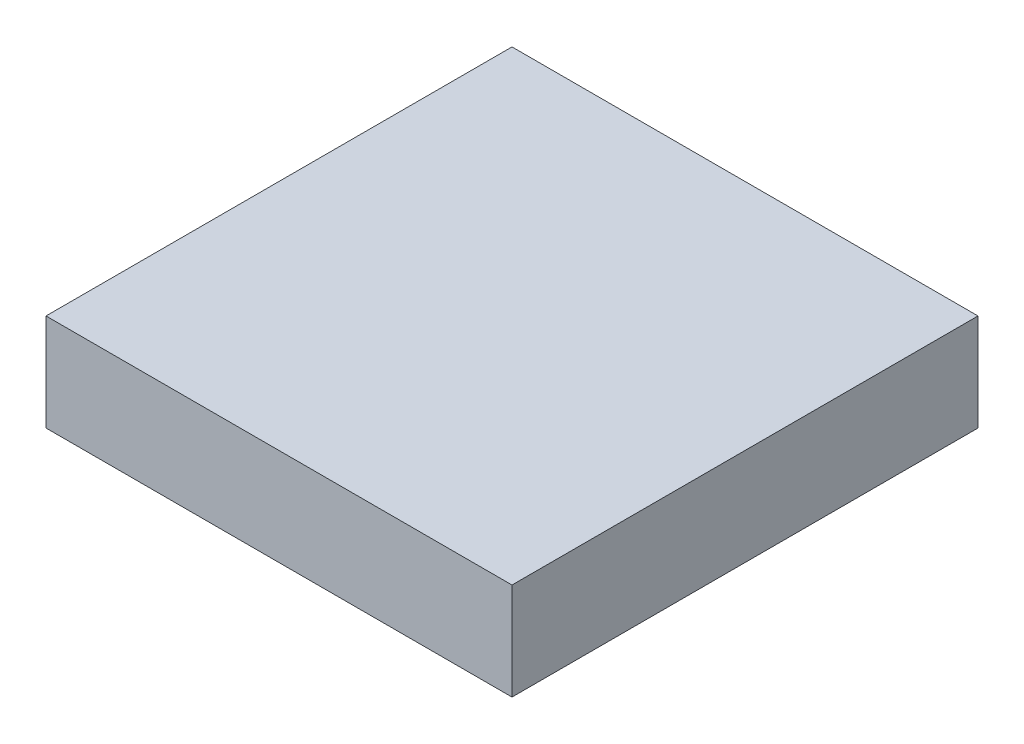
ISO-10303-21;
HEADER;
FILE_DESCRIPTION(('STEP AP214'),'2;1');
FILE_NAME('part.step','',(''),(''),'','','');
FILE_SCHEMA(('AUTOMOTIVE_DESIGN { 1 0 10303 214 1 1 1 1 }'));
ENDSEC;
DATA;
#1=APPLICATION_CONTEXT('core data for automotive mechanical design processes');
#2=APPLICATION_PROTOCOL_DEFINITION('international standard','automotive_design',2000,#1);
#3=PRODUCT_CONTEXT('',#1,'mechanical');
#4=PRODUCT('Part','Part','',(#3));
#5=PRODUCT_RELATED_PRODUCT_CATEGORY('part','',(#4));
#6=PRODUCT_DEFINITION_FORMATION('','',#4);
#7=PRODUCT_DEFINITION_CONTEXT('part definition',#1,'design');
#8=PRODUCT_DEFINITION('design','',#6,#7);
#9=PRODUCT_DEFINITION_SHAPE('','',#8);
#10=(LENGTH_UNIT() NAMED_UNIT(*) SI_UNIT(.MILLI.,.METRE.));
#11=(NAMED_UNIT(*) PLANE_ANGLE_UNIT() SI_UNIT($,.RADIAN.));
#12=(NAMED_UNIT(*) SI_UNIT($,.STERADIAN.) SOLID_ANGLE_UNIT());
#13=UNCERTAINTY_MEASURE_WITH_UNIT(LENGTH_MEASURE(1.E-05),#10,'distance_accuracy_value','');
#14=(GEOMETRIC_REPRESENTATION_CONTEXT(3) GLOBAL_UNCERTAINTY_ASSIGNED_CONTEXT((#13)) GLOBAL_UNIT_ASSIGNED_CONTEXT((#10,
#11,#12)) REPRESENTATION_CONTEXT('',''));
#15=CARTESIAN_POINT('',(0.,0.,0.));
#16=DIRECTION('',(0.,0.,1.));
#17=DIRECTION('',(1.,0.,0.));
#18=AXIS2_PLACEMENT_3D('',#15,#16,#17);
#19=CARTESIAN_POINT('',(60.,25.,60.));
#20=DIRECTION('',(-1.,0.,0.));
#21=DIRECTION('',(0.,0.,1.));
#22=AXIS2_PLACEMENT_3D('',#19,#20,#21);
#23=PLANE('',#22);
#24=DIRECTION('',(0.,0.,-1.));
#25=VECTOR('',#24,1.);
#26=CARTESIAN_POINT('',(60.,0.,60.));
#27=LINE('',#26,#25);
#28=CARTESIAN_POINT('',(60.,0.,60.));
#29=VERTEX_POINT('',#28);
#30=CARTESIAN_POINT('',(60.,0.,-60.));
#31=VERTEX_POINT('',#30);
#32=EDGE_CURVE('E105',#29,#31,#27,.T.);
#33=ORIENTED_EDGE('',*,*,#32,.T.);
#34=DIRECTION('',(0.,-1.,0.));
#35=VECTOR('',#34,1.);
#36=CARTESIAN_POINT('',(60.,25.,-60.));
#37=LINE('',#36,#35);
#38=CARTESIAN_POINT('',(60.,25.,-60.));
#39=VERTEX_POINT('',#38);
#40=EDGE_CURVE('E11',#39,#31,#37,.T.);
#41=ORIENTED_EDGE('',*,*,#40,.F.);
#42=DIRECTION('',(0.,0.,-1.));
#43=VECTOR('',#42,1.);
#44=CARTESIAN_POINT('',(60.,25.,60.));
#45=LINE('',#44,#43);
#46=CARTESIAN_POINT('',(60.,25.,60.));
#47=VERTEX_POINT('',#46);
#48=EDGE_CURVE('E91',#47,#39,#45,.T.);
#49=ORIENTED_EDGE('',*,*,#48,.F.);
#50=DIRECTION('',(0.,-1.,0.));
#51=VECTOR('',#50,1.);
#52=CARTESIAN_POINT('',(60.,25.,60.));
#53=LINE('',#52,#51);
#54=EDGE_CURVE('E101',#47,#29,#53,.T.);
#55=ORIENTED_EDGE('',*,*,#54,.T.);
#56=EDGE_LOOP('',(#33,#41,#49,#55));
#57=FACE_BOUND('',#56,.T.);
#58=ADVANCED_FACE('F41',(#57),#23,.F.);
#59=CARTESIAN_POINT('',(-60.,25.,-60.));
#60=DIRECTION('',(0.,0.,1.));
#61=DIRECTION('',(1.,0.,0.));
#62=AXIS2_PLACEMENT_3D('',#59,#60,#61);
#63=PLANE('',#62);
#64=DIRECTION('',(-1.,0.,0.));
#65=VECTOR('',#64,1.);
#66=CARTESIAN_POINT('',(-60.,0.,-60.));
#67=LINE('',#66,#65);
#68=CARTESIAN_POINT('',(-60.,0.,-60.));
#69=VERTEX_POINT('',#68);
#70=EDGE_CURVE('E96',#31,#69,#67,.T.);
#71=ORIENTED_EDGE('',*,*,#70,.T.);
#72=DIRECTION('',(0.,-1.,0.));
#73=VECTOR('',#72,1.);
#74=CARTESIAN_POINT('',(-60.,25.,-60.));
#75=LINE('',#74,#73);
#76=CARTESIAN_POINT('',(-60.,25.,-60.));
#77=VERTEX_POINT('',#76);
#78=EDGE_CURVE('E49',#77,#69,#75,.T.);
#79=ORIENTED_EDGE('',*,*,#78,.F.);
#80=DIRECTION('',(-1.,0.,0.));
#81=VECTOR('',#80,1.);
#82=CARTESIAN_POINT('',(-60.,25.,-60.));
#83=LINE('',#82,#81);
#84=EDGE_CURVE('E85',#39,#77,#83,.T.);
#85=ORIENTED_EDGE('',*,*,#84,.F.);
#86=ORIENTED_EDGE('',*,*,#40,.T.);
#87=EDGE_LOOP('',(#71,#79,#85,#86));
#88=FACE_BOUND('',#87,.T.);
#89=ADVANCED_FACE('F95',(#88),#63,.F.);
#90=CARTESIAN_POINT('',(-60.,25.,60.));
#91=DIRECTION('',(1.,0.,0.));
#92=DIRECTION('',(0.,0.,-1.));
#93=AXIS2_PLACEMENT_3D('',#90,#91,#92);
#94=PLANE('',#93);
#95=DIRECTION('',(0.,0.,1.));
#96=VECTOR('',#95,1.);
#97=CARTESIAN_POINT('',(-60.,0.,60.));
#98=LINE('',#97,#96);
#99=CARTESIAN_POINT('',(-60.,0.,60.));
#100=VERTEX_POINT('',#99);
#101=EDGE_CURVE('E109',#69,#100,#98,.T.);
#102=ORIENTED_EDGE('',*,*,#101,.T.);
#103=DIRECTION('',(0.,-1.,0.));
#104=VECTOR('',#103,1.);
#105=CARTESIAN_POINT('',(-60.,25.,60.));
#106=LINE('',#105,#104);
#107=CARTESIAN_POINT('',(-60.,25.,60.));
#108=VERTEX_POINT('',#107);
#109=EDGE_CURVE('E98',#108,#100,#106,.T.);
#110=ORIENTED_EDGE('',*,*,#109,.F.);
#111=DIRECTION('',(0.,0.,1.));
#112=VECTOR('',#111,1.);
#113=CARTESIAN_POINT('',(-60.,25.,60.));
#114=LINE('',#113,#112);
#115=EDGE_CURVE('E88',#77,#108,#114,.T.);
#116=ORIENTED_EDGE('',*,*,#115,.F.);
#117=ORIENTED_EDGE('',*,*,#78,.T.);
#118=EDGE_LOOP('',(#102,#110,#116,#117));
#119=FACE_BOUND('',#118,.T.);
#120=ADVANCED_FACE('F99',(#119),#94,.F.);
#121=CARTESIAN_POINT('',(32.177273624243,25.,60.));
#122=DIRECTION('',(0.,0.,-1.));
#123=DIRECTION('',(-1.,0.,0.));
#124=AXIS2_PLACEMENT_3D('',#121,#122,#123);
#125=PLANE('',#124);
#126=DIRECTION('',(1.,0.,0.));
#127=VECTOR('',#126,1.);
#128=CARTESIAN_POINT('',(32.177273624243,0.,60.));
#129=LINE('',#128,#127);
#130=EDGE_CURVE('E74',#100,#29,#129,.T.);
#131=ORIENTED_EDGE('',*,*,#130,.T.);
#132=ORIENTED_EDGE('',*,*,#54,.F.);
#133=DIRECTION('',(1.,0.,0.));
#134=VECTOR('',#133,1.);
#135=CARTESIAN_POINT('',(-60.,25.,60.));
#136=LINE('',#135,#134);
#137=EDGE_CURVE('E57',#108,#47,#136,.T.);
#138=ORIENTED_EDGE('',*,*,#137,.F.);
#139=ORIENTED_EDGE('',*,*,#109,.T.);
#140=EDGE_LOOP('',(#131,#132,#138,#139));
#141=FACE_BOUND('',#140,.T.);
#142=ADVANCED_FACE('F113',(#141),#125,.F.);
#143=CARTESIAN_POINT('',(0.,25.,0.));
#144=DIRECTION('',(0.,-1.,0.));
#145=DIRECTION('',(0.,0.,-1.));
#146=AXIS2_PLACEMENT_3D('',#143,#144,#145);
#147=PLANE('',#146);
#148=ORIENTED_EDGE('',*,*,#48,.T.);
#149=ORIENTED_EDGE('',*,*,#84,.T.);
#150=ORIENTED_EDGE('',*,*,#115,.T.);
#151=ORIENTED_EDGE('',*,*,#137,.T.);
#152=EDGE_LOOP('',(#148,#149,#150,#151));
#153=FACE_BOUND('',#152,.T.);
#154=ADVANCED_FACE('F86',(#153),#147,.F.);
#155=CARTESIAN_POINT('',(0.,0.,0.));
#156=DIRECTION('',(0.,-1.,0.));
#157=DIRECTION('',(0.,0.,-1.));
#158=AXIS2_PLACEMENT_3D('',#155,#156,#157);
#159=PLANE('',#158);
#160=ORIENTED_EDGE('',*,*,#32,.F.);
#161=ORIENTED_EDGE('',*,*,#130,.F.);
#162=ORIENTED_EDGE('',*,*,#101,.F.);
#163=ORIENTED_EDGE('',*,*,#70,.F.);
#164=EDGE_LOOP('',(#160,#161,#162,#163));
#165=FACE_BOUND('',#164,.T.);
#166=ADVANCED_FACE('F115',(#165),#159,.T.);
#167=CLOSED_SHELL('',(#58,#89,#120,#142,#154,#166));
#168=MANIFOLD_SOLID_BREP('B2',#167);
#169=ADVANCED_BREP_SHAPE_REPRESENTATION('',(#18,#168),#14);
#170=SHAPE_DEFINITION_REPRESENTATION(#9,#169);
ENDSEC;
END-ISO-10303-21;
